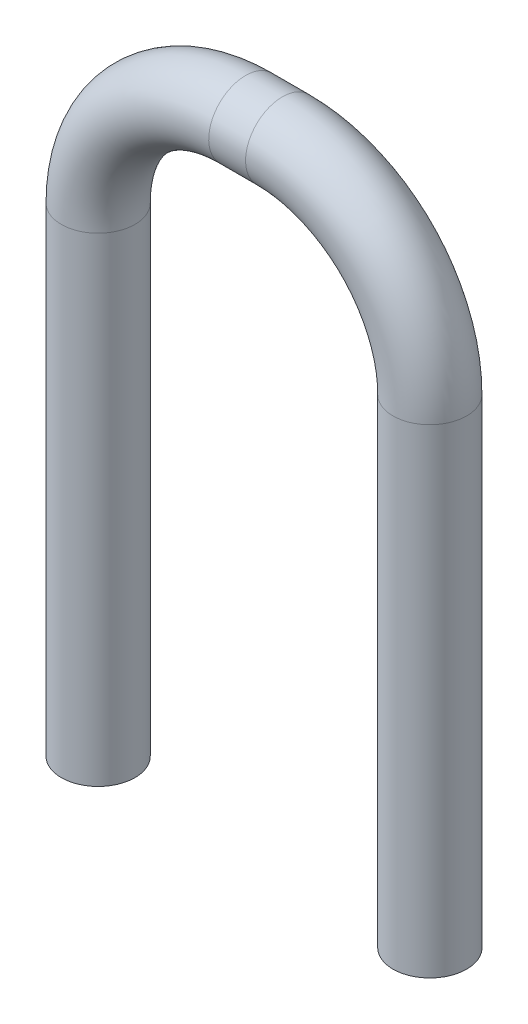
ISO-10303-21;
HEADER;
FILE_DESCRIPTION(('STEP AP214'),'2;1');
FILE_NAME('part.step','',(''),(''),'','','');
FILE_SCHEMA(('AUTOMOTIVE_DESIGN { 1 0 10303 214 1 1 1 1 }'));
ENDSEC;
DATA;
#1=APPLICATION_CONTEXT('core data for automotive mechanical design processes');
#2=APPLICATION_PROTOCOL_DEFINITION('international standard','automotive_design',2000,#1);
#3=PRODUCT_CONTEXT('',#1,'mechanical');
#4=PRODUCT('Part','Part','',(#3));
#5=PRODUCT_RELATED_PRODUCT_CATEGORY('part','',(#4));
#6=PRODUCT_DEFINITION_FORMATION('','',#4);
#7=PRODUCT_DEFINITION_CONTEXT('part definition',#1,'design');
#8=PRODUCT_DEFINITION('design','',#6,#7);
#9=PRODUCT_DEFINITION_SHAPE('','',#8);
#10=(LENGTH_UNIT() NAMED_UNIT(*) SI_UNIT(.MILLI.,.METRE.));
#11=(NAMED_UNIT(*) PLANE_ANGLE_UNIT() SI_UNIT($,.RADIAN.));
#12=(NAMED_UNIT(*) SI_UNIT($,.STERADIAN.) SOLID_ANGLE_UNIT());
#13=UNCERTAINTY_MEASURE_WITH_UNIT(LENGTH_MEASURE(1.E-05),#10,'distance_accuracy_value','');
#14=(GEOMETRIC_REPRESENTATION_CONTEXT(3) GLOBAL_UNCERTAINTY_ASSIGNED_CONTEXT((#13)) GLOBAL_UNIT_ASSIGNED_CONTEXT((#10,
#11,#12)) REPRESENTATION_CONTEXT('',''));
#15=CARTESIAN_POINT('',(0.,0.,0.));
#16=DIRECTION('',(0.,0.,1.));
#17=DIRECTION('',(1.,0.,0.));
#18=AXIS2_PLACEMENT_3D('',#15,#16,#17);
#19=CARTESIAN_POINT('',(4.50000000000001,0.,0.));
#20=DIRECTION('',(0.,-1.,0.));
#21=DIRECTION('',(1.,0.,0.));
#22=AXIS2_PLACEMENT_3D('',#19,#20,#21);
#23=PLANE('',#22);
#24=CARTESIAN_POINT('',(4.50000000000001,0.,0.));
#25=DIRECTION('',(0.,-1.,0.));
#26=DIRECTION('',(1.,0.,0.));
#27=AXIS2_PLACEMENT_3D('',#24,#25,#26);
#28=CIRCLE('',#27,1.);
#29=CARTESIAN_POINT('',(5.50000000000001,0.,0.));
#30=VERTEX_POINT('',#29);
#31=EDGE_CURVE('E56',#30,#30,#28,.T.);
#32=ORIENTED_EDGE('',*,*,#31,.T.);
#33=EDGE_LOOP('',(#32));
#34=FACE_BOUND('',#33,.T.);
#35=ADVANCED_FACE('F44',(#34),#23,.T.);
#36=CARTESIAN_POINT('',(-4.50000000000001,0.,0.));
#37=DIRECTION('',(0.,1.,0.));
#38=DIRECTION('',(-1.,0.,0.));
#39=AXIS2_PLACEMENT_3D('',#36,#37,#38);
#40=PLANE('',#39);
#41=CARTESIAN_POINT('',(-4.50000000000001,0.,0.));
#42=DIRECTION('',(0.,1.,0.));
#43=DIRECTION('',(-1.,0.,0.));
#44=AXIS2_PLACEMENT_3D('',#41,#42,#43);
#45=CIRCLE('',#44,1.);
#46=CARTESIAN_POINT('',(-5.50000000000001,0.,0.));
#47=VERTEX_POINT('',#46);
#48=EDGE_CURVE('E12',#47,#47,#45,.T.);
#49=ORIENTED_EDGE('',*,*,#48,.F.);
#50=EDGE_LOOP('',(#49));
#51=FACE_BOUND('',#50,.T.);
#52=ADVANCED_FACE('F62',(#51),#40,.F.);
#53=CARTESIAN_POINT('',(4.50000000000001,0.,0.));
#54=DIRECTION('',(0.,1.,0.));
#55=DIRECTION('',(-1.,0.,0.));
#56=AXIS2_PLACEMENT_3D('',#53,#54,#55);
#57=CYLINDRICAL_SURFACE('',#56,1.);
#58=CARTESIAN_POINT('',(4.5,13.,0.));
#59=DIRECTION('',(0.,-1.,0.));
#60=DIRECTION('',(1.,0.,0.));
#61=AXIS2_PLACEMENT_3D('',#58,#59,#60);
#62=CIRCLE('',#61,1.);
#63=CARTESIAN_POINT('',(5.5,13.,0.));
#64=VERTEX_POINT('',#63);
#65=EDGE_CURVE('E96',#64,#64,#62,.T.);
#66=ORIENTED_EDGE('',*,*,#65,.T.);
#67=EDGE_LOOP('',(#66));
#68=FACE_BOUND('',#67,.T.);
#69=ORIENTED_EDGE('',*,*,#31,.F.);
#70=EDGE_LOOP('',(#69));
#71=FACE_BOUND('',#70,.T.);
#72=ADVANCED_FACE('F64',(#68,#71),#57,.T.);
#73=CARTESIAN_POINT('',(0.5,13.,0.));
#74=DIRECTION('',(0.,0.,1.));
#75=DIRECTION('',(1.,0.,0.));
#76=AXIS2_PLACEMENT_3D('',#73,#74,#75);
#77=TOROIDAL_SURFACE('',#76,4.,1.);
#78=CARTESIAN_POINT('',(0.5,17.,0.));
#79=DIRECTION('',(1.,0.,0.));
#80=DIRECTION('',(0.,1.,0.));
#81=AXIS2_PLACEMENT_3D('',#78,#79,#80);
#82=CIRCLE('',#81,1.);
#83=CARTESIAN_POINT('',(0.500000000000001,18.,0.));
#84=VERTEX_POINT('',#83);
#85=EDGE_CURVE('E93',#84,#84,#82,.T.);
#86=CARTESIAN_POINT('',(0.5,13.,0.));
#87=DIRECTION('',(0.,0.,1.));
#88=DIRECTION('',(1.,0.,0.));
#89=AXIS2_PLACEMENT_3D('',#86,#87,#88);
#90=CIRCLE('',#89,5.);
#91=EDGE_CURVE('',#64,#84,#90,.T.);
#92=ORIENTED_EDGE('',*,*,#65,.F.);
#93=ORIENTED_EDGE('',*,*,#85,.T.);
#94=ORIENTED_EDGE('',*,*,#91,.T.);
#95=ORIENTED_EDGE('',*,*,#91,.F.);
#96=EDGE_LOOP('',(#92,#94,#93,#95));
#97=FACE_BOUND('',#96,.T.);
#98=ADVANCED_FACE('F69',(#97),#77,.T.);
#99=CARTESIAN_POINT('',(0.499999999999999,17.,0.));
#100=DIRECTION('',(-1.,0.,0.));
#101=DIRECTION('',(0.,0.,1.));
#102=AXIS2_PLACEMENT_3D('',#99,#100,#101);
#103=CYLINDRICAL_SURFACE('',#102,1.);
#104=CARTESIAN_POINT('',(-0.5,17.,0.));
#105=DIRECTION('',(1.,0.,0.));
#106=DIRECTION('',(0.,1.,0.));
#107=AXIS2_PLACEMENT_3D('',#104,#105,#106);
#108=CIRCLE('',#107,1.);
#109=CARTESIAN_POINT('',(-0.5,18.,0.));
#110=VERTEX_POINT('',#109);
#111=EDGE_CURVE('E98',#110,#110,#108,.T.);
#112=ORIENTED_EDGE('',*,*,#111,.T.);
#113=EDGE_LOOP('',(#112));
#114=FACE_BOUND('',#113,.T.);
#115=ORIENTED_EDGE('',*,*,#85,.F.);
#116=EDGE_LOOP('',(#115));
#117=FACE_BOUND('',#116,.T.);
#118=ADVANCED_FACE('F79',(#114,#117),#103,.T.);
#119=CARTESIAN_POINT('',(-0.5,13.,0.));
#120=DIRECTION('',(0.,0.,1.));
#121=DIRECTION('',(1.,0.,0.));
#122=AXIS2_PLACEMENT_3D('',#119,#120,#121);
#123=TOROIDAL_SURFACE('',#122,4.,1.);
#124=CARTESIAN_POINT('',(-4.5,13.,0.));
#125=DIRECTION('',(0.,1.,0.));
#126=DIRECTION('',(-1.,0.,0.));
#127=AXIS2_PLACEMENT_3D('',#124,#125,#126);
#128=CIRCLE('',#127,1.);
#129=CARTESIAN_POINT('',(-5.5,13.,0.));
#130=VERTEX_POINT('',#129);
#131=EDGE_CURVE('E51',#130,#130,#128,.T.);
#132=CARTESIAN_POINT('',(-0.5,13.,0.));
#133=DIRECTION('',(0.,0.,1.));
#134=DIRECTION('',(1.,0.,0.));
#135=AXIS2_PLACEMENT_3D('',#132,#133,#134);
#136=CIRCLE('',#135,5.);
#137=EDGE_CURVE('',#110,#130,#136,.T.);
#138=ORIENTED_EDGE('',*,*,#111,.F.);
#139=ORIENTED_EDGE('',*,*,#131,.T.);
#140=ORIENTED_EDGE('',*,*,#137,.T.);
#141=ORIENTED_EDGE('',*,*,#137,.F.);
#142=EDGE_LOOP('',(#138,#140,#139,#141));
#143=FACE_BOUND('',#142,.T.);
#144=ADVANCED_FACE('F75',(#143),#123,.T.);
#145=CARTESIAN_POINT('',(-4.5,13.,0.));
#146=DIRECTION('',(0.,-1.,0.));
#147=DIRECTION('',(1.,0.,0.));
#148=AXIS2_PLACEMENT_3D('',#145,#146,#147);
#149=CYLINDRICAL_SURFACE('',#148,1.);
#150=ORIENTED_EDGE('',*,*,#48,.T.);
#151=EDGE_LOOP('',(#150));
#152=FACE_BOUND('',#151,.T.);
#153=ORIENTED_EDGE('',*,*,#131,.F.);
#154=EDGE_LOOP('',(#153));
#155=FACE_BOUND('',#154,.T.);
#156=ADVANCED_FACE('F59',(#152,#155),#149,.T.);
#157=CLOSED_SHELL('',(#35,#52,#72,#98,#118,#144,#156));
#158=MANIFOLD_SOLID_BREP('B2',#157);
#159=ADVANCED_BREP_SHAPE_REPRESENTATION('',(#18,#158),#14);
#160=SHAPE_DEFINITION_REPRESENTATION(#9,#159);
ENDSEC;
END-ISO-10303-21;
